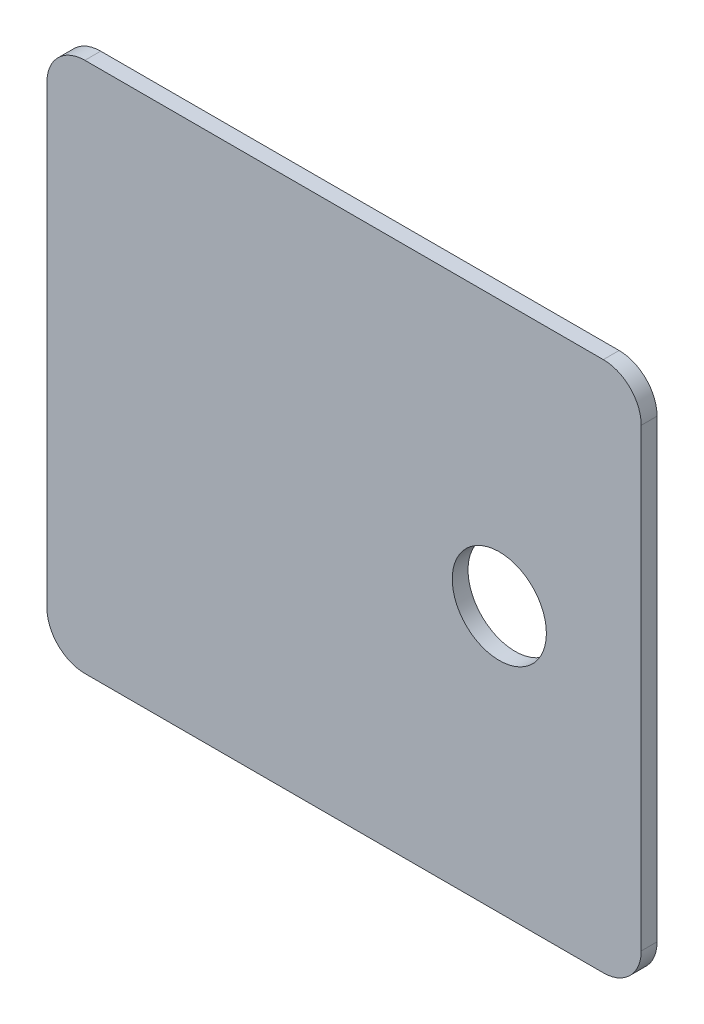
ISO-10303-21;
HEADER;
FILE_DESCRIPTION(('STEP AP214'),'2;1');
FILE_NAME('part.step','',(''),(''),'','','');
FILE_SCHEMA(('AUTOMOTIVE_DESIGN { 1 0 10303 214 1 1 1 1 }'));
ENDSEC;
DATA;
#1=APPLICATION_CONTEXT('core data for automotive mechanical design processes');
#2=APPLICATION_PROTOCOL_DEFINITION('international standard','automotive_design',2000,#1);
#3=PRODUCT_CONTEXT('',#1,'mechanical');
#4=PRODUCT('Part','Part','',(#3));
#5=PRODUCT_RELATED_PRODUCT_CATEGORY('part','',(#4));
#6=PRODUCT_DEFINITION_FORMATION('','',#4);
#7=PRODUCT_DEFINITION_CONTEXT('part definition',#1,'design');
#8=PRODUCT_DEFINITION('design','',#6,#7);
#9=PRODUCT_DEFINITION_SHAPE('','',#8);
#10=(LENGTH_UNIT() NAMED_UNIT(*) SI_UNIT(.MILLI.,.METRE.));
#11=(NAMED_UNIT(*) PLANE_ANGLE_UNIT() SI_UNIT($,.RADIAN.));
#12=(NAMED_UNIT(*) SI_UNIT($,.STERADIAN.) SOLID_ANGLE_UNIT());
#13=UNCERTAINTY_MEASURE_WITH_UNIT(LENGTH_MEASURE(1.E-05),#10,'distance_accuracy_value','');
#14=(GEOMETRIC_REPRESENTATION_CONTEXT(3) GLOBAL_UNCERTAINTY_ASSIGNED_CONTEXT((#13)) GLOBAL_UNIT_ASSIGNED_CONTEXT((#10,
#11,#12)) REPRESENTATION_CONTEXT('',''));
#15=CARTESIAN_POINT('',(0.,0.,0.));
#16=DIRECTION('',(0.,0.,1.));
#17=DIRECTION('',(1.,0.,0.));
#18=AXIS2_PLACEMENT_3D('',#15,#16,#17);
#19=CARTESIAN_POINT('',(0.,0.,2.5));
#20=DIRECTION('',(0.,0.,1.));
#21=DIRECTION('',(1.,0.,0.));
#22=AXIS2_PLACEMENT_3D('',#19,#20,#21);
#23=PLANE('',#22);
#24=DIRECTION('',(-1.,0.,0.));
#25=VECTOR('',#24,1.);
#26=CARTESIAN_POINT('',(-64.9,70.7500000000001,2.5));
#27=LINE('',#26,#25);
#28=CARTESIAN_POINT('',(23.1,70.7500000000001,2.5));
#29=VERTEX_POINT('',#28);
#30=CARTESIAN_POINT('',(-58.9,70.7500000000001,2.5));
#31=VERTEX_POINT('',#30);
#32=EDGE_CURVE('E136',#29,#31,#27,.T.);
#33=ORIENTED_EDGE('',*,*,#32,.T.);
#34=CARTESIAN_POINT('',(-58.9,64.7500000000001,2.5));
#35=DIRECTION('',(0.,0.,1.));
#36=DIRECTION('',(1.,0.,0.));
#37=AXIS2_PLACEMENT_3D('',#34,#35,#36);
#38=CIRCLE('',#37,6.);
#39=CARTESIAN_POINT('',(-64.9,64.7500000000001,2.5));
#40=VERTEX_POINT('',#39);
#41=EDGE_CURVE('E155',#31,#40,#38,.T.);
#42=ORIENTED_EDGE('',*,*,#41,.T.);
#43=DIRECTION('',(0.,-1.,0.));
#44=VECTOR('',#43,1.);
#45=CARTESIAN_POINT('',(-64.9,70.7500000000001,2.5));
#46=LINE('',#45,#44);
#47=CARTESIAN_POINT('',(-64.9,-7.24999999999988,2.5));
#48=VERTEX_POINT('',#47);
#49=EDGE_CURVE('E119',#40,#48,#46,.T.);
#50=ORIENTED_EDGE('',*,*,#49,.T.);
#51=CARTESIAN_POINT('',(-58.9,-7.24999999999989,2.5));
#52=DIRECTION('',(0.,0.,1.));
#53=DIRECTION('',(1.,0.,0.));
#54=AXIS2_PLACEMENT_3D('',#51,#52,#53);
#55=CIRCLE('',#54,6.);
#56=CARTESIAN_POINT('',(-58.9,-13.2499999999999,2.5));
#57=VERTEX_POINT('',#56);
#58=EDGE_CURVE('E150',#48,#57,#55,.T.);
#59=ORIENTED_EDGE('',*,*,#58,.T.);
#60=DIRECTION('',(1.,0.,0.));
#61=VECTOR('',#60,1.);
#62=CARTESIAN_POINT('',(-64.9,-13.2499999999999,2.5));
#63=LINE('',#62,#61);
#64=CARTESIAN_POINT('',(23.1,-13.2499999999999,2.5));
#65=VERTEX_POINT('',#64);
#66=EDGE_CURVE('E166',#57,#65,#63,.T.);
#67=ORIENTED_EDGE('',*,*,#66,.T.);
#68=CARTESIAN_POINT('',(23.1,-7.24999999999988,2.5));
#69=DIRECTION('',(0.,0.,1.));
#70=DIRECTION('',(1.,0.,0.));
#71=AXIS2_PLACEMENT_3D('',#68,#69,#70);
#72=CIRCLE('',#71,6.);
#73=CARTESIAN_POINT('',(29.1,-7.24999999999988,2.5));
#74=VERTEX_POINT('',#73);
#75=EDGE_CURVE('E55',#65,#74,#72,.T.);
#76=ORIENTED_EDGE('',*,*,#75,.T.);
#77=DIRECTION('',(0.,1.,0.));
#78=VECTOR('',#77,1.);
#79=CARTESIAN_POINT('',(29.1,70.7500000000001,2.5));
#80=LINE('',#79,#78);
#81=CARTESIAN_POINT('',(29.1,64.7500000000001,2.5));
#82=VERTEX_POINT('',#81);
#83=EDGE_CURVE('E174',#74,#82,#80,.T.);
#84=ORIENTED_EDGE('',*,*,#83,.T.);
#85=CARTESIAN_POINT('',(23.1,64.7500000000001,2.5));
#86=DIRECTION('',(0.,0.,1.));
#87=DIRECTION('',(1.,0.,0.));
#88=AXIS2_PLACEMENT_3D('',#85,#86,#87);
#89=CIRCLE('',#88,6.);
#90=EDGE_CURVE('E153',#82,#29,#89,.T.);
#91=ORIENTED_EDGE('',*,*,#90,.T.);
#92=EDGE_LOOP('',(#33,#42,#50,#59,#67,#76,#84,#91));
#93=FACE_BOUND('',#92,.T.);
#94=CARTESIAN_POINT('',(6.65000000000002,28.7500000000003,2.5));
#95=DIRECTION('',(0.,0.,1.));
#96=DIRECTION('',(1.,0.,0.));
#97=AXIS2_PLACEMENT_3D('',#94,#95,#96);
#98=CIRCLE('',#97,7.44562454455838);
#99=CARTESIAN_POINT('',(14.0956245445584,28.7500000000003,2.5));
#100=VERTEX_POINT('',#99);
#101=EDGE_CURVE('E127',#100,#100,#98,.T.);
#102=ORIENTED_EDGE('',*,*,#101,.F.);
#103=EDGE_LOOP('',(#102));
#104=FACE_BOUND('',#103,.T.);
#105=ADVANCED_FACE('F33',(#93,#104),#23,.T.);
#106=CARTESIAN_POINT('',(0.,0.,0.));
#107=DIRECTION('',(0.,0.,1.));
#108=DIRECTION('',(1.,0.,0.));
#109=AXIS2_PLACEMENT_3D('',#106,#107,#108);
#110=PLANE('',#109);
#111=DIRECTION('',(0.,-1.,0.));
#112=VECTOR('',#111,1.);
#113=CARTESIAN_POINT('',(-64.9,70.7500000000001,0.));
#114=LINE('',#113,#112);
#115=CARTESIAN_POINT('',(-64.9,64.7500000000001,0.));
#116=VERTEX_POINT('',#115);
#117=CARTESIAN_POINT('',(-64.9,-7.24999999999988,0.));
#118=VERTEX_POINT('',#117);
#119=EDGE_CURVE('E116',#116,#118,#114,.T.);
#120=ORIENTED_EDGE('',*,*,#119,.F.);
#121=CARTESIAN_POINT('',(-58.9,64.7500000000001,0.));
#122=DIRECTION('',(0.,0.,1.));
#123=DIRECTION('',(1.,0.,0.));
#124=AXIS2_PLACEMENT_3D('',#121,#122,#123);
#125=CIRCLE('',#124,6.);
#126=CARTESIAN_POINT('',(-58.9,70.7500000000001,0.));
#127=VERTEX_POINT('',#126);
#128=EDGE_CURVE('E99',#116,#127,#125,.F.);
#129=ORIENTED_EDGE('',*,*,#128,.T.);
#130=DIRECTION('',(-1.,0.,0.));
#131=VECTOR('',#130,1.);
#132=CARTESIAN_POINT('',(-64.9,70.7500000000001,0.));
#133=LINE('',#132,#131);
#134=CARTESIAN_POINT('',(23.1,70.7500000000001,0.));
#135=VERTEX_POINT('',#134);
#136=EDGE_CURVE('E140',#135,#127,#133,.T.);
#137=ORIENTED_EDGE('',*,*,#136,.F.);
#138=CARTESIAN_POINT('',(23.1,64.7500000000001,0.));
#139=DIRECTION('',(0.,0.,1.));
#140=DIRECTION('',(1.,0.,0.));
#141=AXIS2_PLACEMENT_3D('',#138,#139,#140);
#142=CIRCLE('',#141,6.);
#143=CARTESIAN_POINT('',(29.1,64.7500000000001,0.));
#144=VERTEX_POINT('',#143);
#145=EDGE_CURVE('E110',#135,#144,#142,.F.);
#146=ORIENTED_EDGE('',*,*,#145,.T.);
#147=DIRECTION('',(0.,1.,0.));
#148=VECTOR('',#147,1.);
#149=CARTESIAN_POINT('',(29.1,70.7500000000001,0.));
#150=LINE('',#149,#148);
#151=CARTESIAN_POINT('',(29.1,-7.24999999999988,0.));
#152=VERTEX_POINT('',#151);
#153=EDGE_CURVE('E130',#152,#144,#150,.T.);
#154=ORIENTED_EDGE('',*,*,#153,.F.);
#155=CARTESIAN_POINT('',(23.1,-7.24999999999988,0.));
#156=DIRECTION('',(0.,0.,1.));
#157=DIRECTION('',(1.,0.,0.));
#158=AXIS2_PLACEMENT_3D('',#155,#156,#157);
#159=CIRCLE('',#158,6.);
#160=CARTESIAN_POINT('',(23.1,-13.2499999999999,0.));
#161=VERTEX_POINT('',#160);
#162=EDGE_CURVE('E144',#152,#161,#159,.F.);
#163=ORIENTED_EDGE('',*,*,#162,.T.);
#164=DIRECTION('',(1.,0.,0.));
#165=VECTOR('',#164,1.);
#166=CARTESIAN_POINT('',(-64.9,-13.2499999999999,0.));
#167=LINE('',#166,#165);
#168=CARTESIAN_POINT('',(-58.9,-13.2499999999999,0.));
#169=VERTEX_POINT('',#168);
#170=EDGE_CURVE('E126',#169,#161,#167,.T.);
#171=ORIENTED_EDGE('',*,*,#170,.F.);
#172=CARTESIAN_POINT('',(-58.9,-7.24999999999989,0.));
#173=DIRECTION('',(0.,0.,1.));
#174=DIRECTION('',(1.,0.,0.));
#175=AXIS2_PLACEMENT_3D('',#172,#173,#174);
#176=CIRCLE('',#175,6.);
#177=EDGE_CURVE('E120',#169,#118,#176,.F.);
#178=ORIENTED_EDGE('',*,*,#177,.T.);
#179=EDGE_LOOP('',(#120,#129,#137,#146,#154,#163,#171,#178));
#180=FACE_BOUND('',#179,.T.);
#181=CARTESIAN_POINT('',(6.65000000000002,28.7500000000003,0.));
#182=DIRECTION('',(0.,0.,1.));
#183=DIRECTION('',(1.,0.,0.));
#184=AXIS2_PLACEMENT_3D('',#181,#182,#183);
#185=CIRCLE('',#184,7.44562454455838);
#186=CARTESIAN_POINT('',(14.0956245445584,28.7500000000003,0.));
#187=VERTEX_POINT('',#186);
#188=EDGE_CURVE('E133',#187,#187,#185,.T.);
#189=ORIENTED_EDGE('',*,*,#188,.T.);
#190=EDGE_LOOP('',(#189));
#191=FACE_BOUND('',#190,.T.);
#192=ADVANCED_FACE('F123',(#180,#191),#110,.F.);
#193=CARTESIAN_POINT('',(-64.9,70.7500000000001,2.5));
#194=DIRECTION('',(1.,0.,0.));
#195=DIRECTION('',(0.,0.,-1.));
#196=AXIS2_PLACEMENT_3D('',#193,#194,#195);
#197=PLANE('',#196);
#198=ORIENTED_EDGE('',*,*,#49,.F.);
#199=DIRECTION('',(0.,0.,-1.));
#200=VECTOR('',#199,1.);
#201=CARTESIAN_POINT('',(-64.9,64.7500000000001,2.5));
#202=LINE('',#201,#200);
#203=EDGE_CURVE('E103',#40,#116,#202,.T.);
#204=ORIENTED_EDGE('',*,*,#203,.T.);
#205=ORIENTED_EDGE('',*,*,#119,.T.);
#206=DIRECTION('',(0.,0.,-1.));
#207=VECTOR('',#206,1.);
#208=CARTESIAN_POINT('',(-64.9,-7.24999999999988,2.5));
#209=LINE('',#208,#207);
#210=EDGE_CURVE('E121',#118,#48,#209,.F.);
#211=ORIENTED_EDGE('',*,*,#210,.T.);
#212=EDGE_LOOP('',(#198,#204,#205,#211));
#213=FACE_BOUND('',#212,.T.);
#214=ADVANCED_FACE('F115',(#213),#197,.F.);
#215=CARTESIAN_POINT('',(-64.9,-13.2499999999999,2.5));
#216=DIRECTION('',(0.,1.,0.));
#217=DIRECTION('',(0.,0.,1.));
#218=AXIS2_PLACEMENT_3D('',#215,#216,#217);
#219=PLANE('',#218);
#220=ORIENTED_EDGE('',*,*,#170,.T.);
#221=DIRECTION('',(0.,0.,-1.));
#222=VECTOR('',#221,1.);
#223=CARTESIAN_POINT('',(23.1,-13.2499999999999,2.5));
#224=LINE('',#223,#222);
#225=EDGE_CURVE('E11',#161,#65,#224,.F.);
#226=ORIENTED_EDGE('',*,*,#225,.T.);
#227=ORIENTED_EDGE('',*,*,#66,.F.);
#228=DIRECTION('',(0.,0.,-1.));
#229=VECTOR('',#228,1.);
#230=CARTESIAN_POINT('',(-58.9,-13.2499999999999,2.5));
#231=LINE('',#230,#229);
#232=EDGE_CURVE('E41',#57,#169,#231,.T.);
#233=ORIENTED_EDGE('',*,*,#232,.T.);
#234=EDGE_LOOP('',(#220,#226,#227,#233));
#235=FACE_BOUND('',#234,.T.);
#236=ADVANCED_FACE('F164',(#235),#219,.F.);
#237=CARTESIAN_POINT('',(29.1,70.7500000000001,2.5));
#238=DIRECTION('',(-1.,0.,0.));
#239=DIRECTION('',(0.,0.,1.));
#240=AXIS2_PLACEMENT_3D('',#237,#238,#239);
#241=PLANE('',#240);
#242=ORIENTED_EDGE('',*,*,#153,.T.);
#243=DIRECTION('',(0.,0.,-1.));
#244=VECTOR('',#243,1.);
#245=CARTESIAN_POINT('',(29.1,64.7500000000001,2.5));
#246=LINE('',#245,#244);
#247=EDGE_CURVE('E48',#144,#82,#246,.F.);
#248=ORIENTED_EDGE('',*,*,#247,.T.);
#249=ORIENTED_EDGE('',*,*,#83,.F.);
#250=DIRECTION('',(0.,0.,-1.));
#251=VECTOR('',#250,1.);
#252=CARTESIAN_POINT('',(29.1,-7.24999999999988,2.5));
#253=LINE('',#252,#251);
#254=EDGE_CURVE('E157',#74,#152,#253,.T.);
#255=ORIENTED_EDGE('',*,*,#254,.T.);
#256=EDGE_LOOP('',(#242,#248,#249,#255));
#257=FACE_BOUND('',#256,.T.);
#258=ADVANCED_FACE('F173',(#257),#241,.F.);
#259=CARTESIAN_POINT('',(-64.9,70.7500000000001,2.5));
#260=DIRECTION('',(0.,-1.,0.));
#261=DIRECTION('',(0.,0.,-1.));
#262=AXIS2_PLACEMENT_3D('',#259,#260,#261);
#263=PLANE('',#262);
#264=ORIENTED_EDGE('',*,*,#136,.T.);
#265=DIRECTION('',(0.,0.,-1.));
#266=VECTOR('',#265,1.);
#267=CARTESIAN_POINT('',(-58.9,70.7500000000001,2.5));
#268=LINE('',#267,#266);
#269=EDGE_CURVE('E104',#127,#31,#268,.F.);
#270=ORIENTED_EDGE('',*,*,#269,.T.);
#271=ORIENTED_EDGE('',*,*,#32,.F.);
#272=DIRECTION('',(0.,0.,-1.));
#273=VECTOR('',#272,1.);
#274=CARTESIAN_POINT('',(23.1,70.7500000000001,2.5));
#275=LINE('',#274,#273);
#276=EDGE_CURVE('E109',#29,#135,#275,.T.);
#277=ORIENTED_EDGE('',*,*,#276,.T.);
#278=EDGE_LOOP('',(#264,#270,#271,#277));
#279=FACE_BOUND('',#278,.T.);
#280=ADVANCED_FACE('F185',(#279),#263,.F.);
#281=CARTESIAN_POINT('',(6.65000000000002,28.7500000000003,2.5));
#282=DIRECTION('',(0.,0.,-1.));
#283=DIRECTION('',(-1.,0.,0.));
#284=AXIS2_PLACEMENT_3D('',#281,#282,#283);
#285=CYLINDRICAL_SURFACE('',#284,7.44562454455838);
#286=ORIENTED_EDGE('',*,*,#101,.T.);
#287=EDGE_LOOP('',(#286));
#288=FACE_BOUND('',#287,.T.);
#289=ORIENTED_EDGE('',*,*,#188,.F.);
#290=EDGE_LOOP('',(#289));
#291=FACE_BOUND('',#290,.T.);
#292=ADVANCED_FACE('F183',(#288,#291),#285,.F.);
#293=CARTESIAN_POINT('',(-58.9,64.7500000000001,2.5));
#294=DIRECTION('',(0.,0.,-1.));
#295=DIRECTION('',(-1.,0.,0.));
#296=AXIS2_PLACEMENT_3D('',#293,#294,#295);
#297=CYLINDRICAL_SURFACE('',#296,6.);
#298=ORIENTED_EDGE('',*,*,#41,.F.);
#299=ORIENTED_EDGE('',*,*,#269,.F.);
#300=ORIENTED_EDGE('',*,*,#128,.F.);
#301=ORIENTED_EDGE('',*,*,#203,.F.);
#302=EDGE_LOOP('',(#298,#299,#300,#301));
#303=FACE_BOUND('',#302,.T.);
#304=ADVANCED_FACE('F102',(#303),#297,.T.);
#305=CARTESIAN_POINT('',(23.1,64.7500000000001,2.5));
#306=DIRECTION('',(0.,0.,-1.));
#307=DIRECTION('',(-1.,0.,0.));
#308=AXIS2_PLACEMENT_3D('',#305,#306,#307);
#309=CYLINDRICAL_SURFACE('',#308,6.);
#310=ORIENTED_EDGE('',*,*,#90,.F.);
#311=ORIENTED_EDGE('',*,*,#247,.F.);
#312=ORIENTED_EDGE('',*,*,#145,.F.);
#313=ORIENTED_EDGE('',*,*,#276,.F.);
#314=EDGE_LOOP('',(#310,#311,#312,#313));
#315=FACE_BOUND('',#314,.T.);
#316=ADVANCED_FACE('F192',(#315),#309,.T.);
#317=CARTESIAN_POINT('',(23.1,-7.24999999999988,2.5));
#318=DIRECTION('',(0.,0.,-1.));
#319=DIRECTION('',(-1.,0.,0.));
#320=AXIS2_PLACEMENT_3D('',#317,#318,#319);
#321=CYLINDRICAL_SURFACE('',#320,6.);
#322=ORIENTED_EDGE('',*,*,#75,.F.);
#323=ORIENTED_EDGE('',*,*,#225,.F.);
#324=ORIENTED_EDGE('',*,*,#162,.F.);
#325=ORIENTED_EDGE('',*,*,#254,.F.);
#326=EDGE_LOOP('',(#322,#323,#324,#325));
#327=FACE_BOUND('',#326,.T.);
#328=ADVANCED_FACE('F172',(#327),#321,.T.);
#329=CARTESIAN_POINT('',(-58.9,-7.24999999999989,2.5));
#330=DIRECTION('',(0.,0.,-1.));
#331=DIRECTION('',(-1.,0.,0.));
#332=AXIS2_PLACEMENT_3D('',#329,#330,#331);
#333=CYLINDRICAL_SURFACE('',#332,6.);
#334=ORIENTED_EDGE('',*,*,#58,.F.);
#335=ORIENTED_EDGE('',*,*,#210,.F.);
#336=ORIENTED_EDGE('',*,*,#177,.F.);
#337=ORIENTED_EDGE('',*,*,#232,.F.);
#338=EDGE_LOOP('',(#334,#335,#336,#337));
#339=FACE_BOUND('',#338,.T.);
#340=ADVANCED_FACE('F35',(#339),#333,.T.);
#341=CLOSED_SHELL('',(#105,#192,#214,#236,#258,#280,#292,#304,#316,#328,#340));
#342=MANIFOLD_SOLID_BREP('B2',#341);
#343=ADVANCED_BREP_SHAPE_REPRESENTATION('',(#18,#342),#14);
#344=SHAPE_DEFINITION_REPRESENTATION(#9,#343);
ENDSEC;
END-ISO-10303-21;
